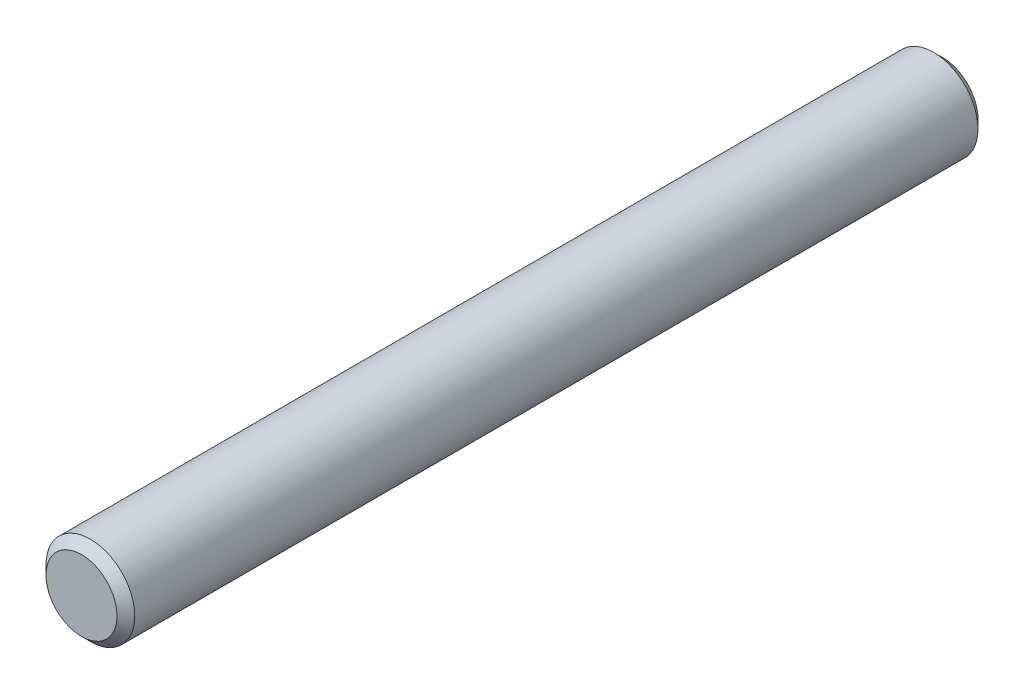
ISO-10303-21;
HEADER;
FILE_DESCRIPTION(('STEP AP214'),'2;1');
FILE_NAME('part.step','',(''),(''),'','','');
FILE_SCHEMA(('AUTOMOTIVE_DESIGN { 1 0 10303 214 1 1 1 1 }'));
ENDSEC;
DATA;
#1=APPLICATION_CONTEXT('core data for automotive mechanical design processes');
#2=APPLICATION_PROTOCOL_DEFINITION('international standard','automotive_design',2000,#1);
#3=PRODUCT_CONTEXT('',#1,'mechanical');
#4=PRODUCT('Part','Part','',(#3));
#5=PRODUCT_RELATED_PRODUCT_CATEGORY('part','',(#4));
#6=PRODUCT_DEFINITION_FORMATION('','',#4);
#7=PRODUCT_DEFINITION_CONTEXT('part definition',#1,'design');
#8=PRODUCT_DEFINITION('design','',#6,#7);
#9=PRODUCT_DEFINITION_SHAPE('','',#8);
#10=(LENGTH_UNIT() NAMED_UNIT(*) SI_UNIT(.MILLI.,.METRE.));
#11=(NAMED_UNIT(*) PLANE_ANGLE_UNIT() SI_UNIT($,.RADIAN.));
#12=(NAMED_UNIT(*) SI_UNIT($,.STERADIAN.) SOLID_ANGLE_UNIT());
#13=UNCERTAINTY_MEASURE_WITH_UNIT(LENGTH_MEASURE(1.E-05),#10,'distance_accuracy_value','');
#14=(GEOMETRIC_REPRESENTATION_CONTEXT(3) GLOBAL_UNCERTAINTY_ASSIGNED_CONTEXT((#13)) GLOBAL_UNIT_ASSIGNED_CONTEXT((#10,
#11,#12)) REPRESENTATION_CONTEXT('',''));
#15=CARTESIAN_POINT('',(0.,0.,0.));
#16=DIRECTION('',(0.,0.,1.));
#17=DIRECTION('',(1.,0.,0.));
#18=AXIS2_PLACEMENT_3D('',#15,#16,#17);
#19=CARTESIAN_POINT('',(0.,0.,0.));
#20=DIRECTION('',(0.,0.,-1.));
#21=DIRECTION('',(-1.,0.,0.));
#22=AXIS2_PLACEMENT_3D('',#19,#20,#21);
#23=PLANE('',#22);
#24=CARTESIAN_POINT('',(0.,0.,0.));
#25=DIRECTION('',(0.,0.,-1.));
#26=DIRECTION('',(-1.,0.,0.));
#27=AXIS2_PLACEMENT_3D('',#24,#25,#26);
#28=CIRCLE('',#27,0.4);
#29=CARTESIAN_POINT('',(-0.4,0.,0.));
#30=VERTEX_POINT('',#29);
#31=EDGE_CURVE('E10',#30,#30,#28,.F.);
#32=ORIENTED_EDGE('',*,*,#31,.T.);
#33=EDGE_LOOP('',(#32));
#34=FACE_BOUND('',#33,.T.);
#35=ADVANCED_FACE('F31',(#34),#23,.F.);
#36=CARTESIAN_POINT('',(0.,0.,5.65420560747663));
#37=DIRECTION('',(0.,0.,1.));
#38=DIRECTION('',(1.,0.,0.));
#39=AXIS2_PLACEMENT_3D('',#36,#37,#38);
#40=CYLINDRICAL_SURFACE('',#39,0.5);
#41=CARTESIAN_POINT('',(0.,0.,-9.6));
#42=DIRECTION('',(0.,0.,1.));
#43=DIRECTION('',(1.,0.,0.));
#44=AXIS2_PLACEMENT_3D('',#41,#42,#43);
#45=CIRCLE('',#44,0.5);
#46=CARTESIAN_POINT('',(0.5,0.,-9.6));
#47=VERTEX_POINT('',#46);
#48=EDGE_CURVE('E42',#47,#47,#45,.T.);
#49=ORIENTED_EDGE('',*,*,#48,.T.);
#50=EDGE_LOOP('',(#49));
#51=FACE_BOUND('',#50,.T.);
#52=CARTESIAN_POINT('',(0.,0.,-0.1));
#53=DIRECTION('',(0.,0.,-1.));
#54=DIRECTION('',(-1.,0.,0.));
#55=AXIS2_PLACEMENT_3D('',#52,#53,#54);
#56=CIRCLE('',#55,0.5);
#57=CARTESIAN_POINT('',(-0.5,0.,-0.1));
#58=VERTEX_POINT('',#57);
#59=EDGE_CURVE('E46',#58,#58,#56,.T.);
#60=ORIENTED_EDGE('',*,*,#59,.T.);
#61=EDGE_LOOP('',(#60));
#62=FACE_BOUND('',#61,.T.);
#63=ADVANCED_FACE('F52',(#51,#62),#40,.T.);
#64=CARTESIAN_POINT('',(0.,0.,-9.7));
#65=DIRECTION('',(0.,0.,1.));
#66=DIRECTION('',(1.,0.,0.));
#67=AXIS2_PLACEMENT_3D('',#64,#65,#66);
#68=PLANE('',#67);
#69=CARTESIAN_POINT('',(0.,0.,-9.7));
#70=DIRECTION('',(0.,0.,1.));
#71=DIRECTION('',(1.,0.,0.));
#72=AXIS2_PLACEMENT_3D('',#69,#70,#71);
#73=CIRCLE('',#72,0.400000000000003);
#74=CARTESIAN_POINT('',(0.400000000000003,0.,-9.7));
#75=VERTEX_POINT('',#74);
#76=EDGE_CURVE('E38',#75,#75,#73,.F.);
#77=ORIENTED_EDGE('',*,*,#76,.T.);
#78=EDGE_LOOP('',(#77));
#79=FACE_BOUND('',#78,.T.);
#80=ADVANCED_FACE('F60',(#79),#68,.F.);
#81=CARTESIAN_POINT('',(0.,0.,-9.6));
#82=DIRECTION('',(0.,0.,1.));
#83=DIRECTION('',(1.,0.,0.));
#84=AXIS2_PLACEMENT_3D('',#81,#82,#83);
#85=CONICAL_SURFACE('',#84,0.5,0.785398163397446);
#86=ORIENTED_EDGE('',*,*,#76,.F.);
#87=EDGE_LOOP('',(#86));
#88=FACE_BOUND('',#87,.T.);
#89=ORIENTED_EDGE('',*,*,#48,.F.);
#90=EDGE_LOOP('',(#89));
#91=FACE_BOUND('',#90,.T.);
#92=ADVANCED_FACE('F56',(#88,#91),#85,.T.);
#93=CARTESIAN_POINT('',(0.,0.,0.));
#94=DIRECTION('',(0.,0.,-1.));
#95=DIRECTION('',(-1.,0.,0.));
#96=AXIS2_PLACEMENT_3D('',#93,#94,#95);
#97=CONICAL_SURFACE('',#96,0.4,0.785398163397446);
#98=ORIENTED_EDGE('',*,*,#59,.F.);
#99=EDGE_LOOP('',(#98));
#100=FACE_BOUND('',#99,.T.);
#101=ORIENTED_EDGE('',*,*,#31,.F.);
#102=EDGE_LOOP('',(#101));
#103=FACE_BOUND('',#102,.T.);
#104=ADVANCED_FACE('F33',(#100,#103),#97,.T.);
#105=CLOSED_SHELL('',(#35,#63,#80,#92,#104));
#106=MANIFOLD_SOLID_BREP('B2',#105);
#107=ADVANCED_BREP_SHAPE_REPRESENTATION('',(#18,#106),#14);
#108=SHAPE_DEFINITION_REPRESENTATION(#9,#107);
ENDSEC;
END-ISO-10303-21;
